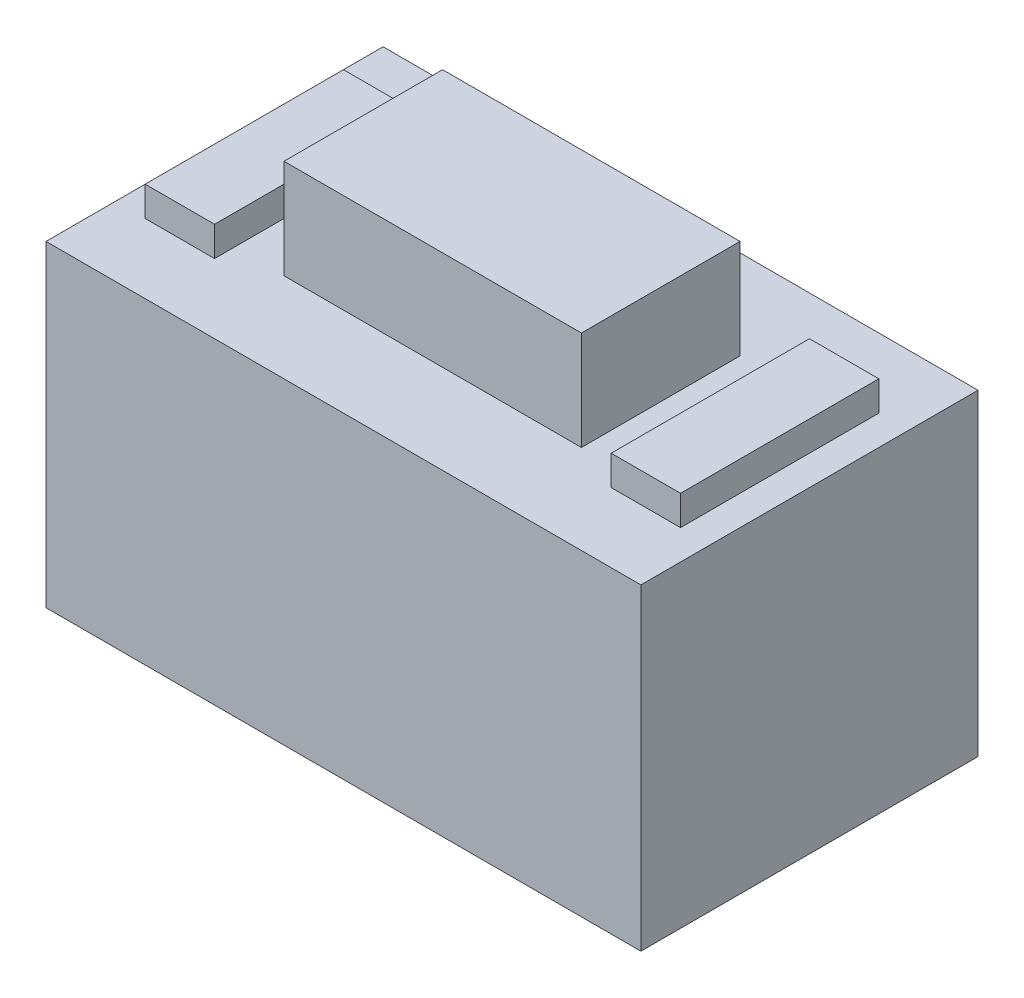
ISO-10303-21;
HEADER;
FILE_DESCRIPTION(('STEP AP214'),'2;1');
FILE_NAME('part.step','',(''),(''),'','','');
FILE_SCHEMA(('AUTOMOTIVE_DESIGN { 1 0 10303 214 1 1 1 1 }'));
ENDSEC;
DATA;
#1=APPLICATION_CONTEXT('core data for automotive mechanical design processes');
#2=APPLICATION_PROTOCOL_DEFINITION('international standard','automotive_design',2000,#1);
#3=PRODUCT_CONTEXT('',#1,'mechanical');
#4=PRODUCT('Part','Part','',(#3));
#5=PRODUCT_RELATED_PRODUCT_CATEGORY('part','',(#4));
#6=PRODUCT_DEFINITION_FORMATION('','',#4);
#7=PRODUCT_DEFINITION_CONTEXT('part definition',#1,'design');
#8=PRODUCT_DEFINITION('design','',#6,#7);
#9=PRODUCT_DEFINITION_SHAPE('','',#8);
#10=(LENGTH_UNIT() NAMED_UNIT(*) SI_UNIT(.MILLI.,.METRE.));
#11=(NAMED_UNIT(*) PLANE_ANGLE_UNIT() SI_UNIT($,.RADIAN.));
#12=(NAMED_UNIT(*) SI_UNIT($,.STERADIAN.) SOLID_ANGLE_UNIT());
#13=UNCERTAINTY_MEASURE_WITH_UNIT(LENGTH_MEASURE(1.E-05),#10,'distance_accuracy_value','');
#14=(GEOMETRIC_REPRESENTATION_CONTEXT(3) GLOBAL_UNCERTAINTY_ASSIGNED_CONTEXT((#13)) GLOBAL_UNIT_ASSIGNED_CONTEXT((#10,
#11,#12)) REPRESENTATION_CONTEXT('',''));
#15=CARTESIAN_POINT('',(0.,0.,0.));
#16=DIRECTION('',(0.,0.,1.));
#17=DIRECTION('',(1.,0.,0.));
#18=AXIS2_PLACEMENT_3D('',#15,#16,#17);
#19=CARTESIAN_POINT('',(-3.,1.6,3.4));
#20=DIRECTION('',(0.,-1.,0.));
#21=DIRECTION('',(0.,0.,-1.));
#22=AXIS2_PLACEMENT_3D('',#19,#20,#21);
#23=PLANE('',#22);
#24=DIRECTION('',(0.,0.,1.));
#25=VECTOR('',#24,1.);
#26=CARTESIAN_POINT('',(-2.7,1.6,0.699999999999999));
#27=LINE('',#26,#25);
#28=CARTESIAN_POINT('',(-2.7,1.6,0.699999999999999));
#29=VERTEX_POINT('',#28);
#30=CARTESIAN_POINT('',(-2.7,1.6,2.7));
#31=VERTEX_POINT('',#30);
#32=EDGE_CURVE('E170',#29,#31,#27,.T.);
#33=ORIENTED_EDGE('',*,*,#32,.F.);
#34=DIRECTION('',(-1.,0.,0.));
#35=VECTOR('',#34,1.);
#36=CARTESIAN_POINT('',(-2.,1.6,0.699999999999999));
#37=LINE('',#36,#35);
#38=CARTESIAN_POINT('',(-2.,1.6,0.699999999999999));
#39=VERTEX_POINT('',#38);
#40=EDGE_CURVE('E183',#39,#29,#37,.T.);
#41=ORIENTED_EDGE('',*,*,#40,.F.);
#42=DIRECTION('',(0.,0.,-1.));
#43=VECTOR('',#42,1.);
#44=CARTESIAN_POINT('',(-2.,1.6,0.699999999999999));
#45=LINE('',#44,#43);
#46=CARTESIAN_POINT('',(-2.,1.6,2.7));
#47=VERTEX_POINT('',#46);
#48=EDGE_CURVE('E192',#47,#39,#45,.T.);
#49=ORIENTED_EDGE('',*,*,#48,.F.);
#50=DIRECTION('',(1.,0.,0.));
#51=VECTOR('',#50,1.);
#52=CARTESIAN_POINT('',(-2.,1.6,2.7));
#53=LINE('',#52,#51);
#54=EDGE_CURVE('E173',#31,#47,#53,.T.);
#55=ORIENTED_EDGE('',*,*,#54,.F.);
#56=EDGE_LOOP('',(#33,#41,#49,#55));
#57=FACE_BOUND('',#56,.T.);
#58=DIRECTION('',(-1.,0.,0.));
#59=VECTOR('',#58,1.);
#60=CARTESIAN_POINT('',(-3.,1.6,0.));
#61=LINE('',#60,#59);
#62=CARTESIAN_POINT('',(3.,1.6,0.));
#63=VERTEX_POINT('',#62);
#64=CARTESIAN_POINT('',(-3.,1.6,0.));
#65=VERTEX_POINT('',#64);
#66=EDGE_CURVE('E255',#63,#65,#61,.T.);
#67=ORIENTED_EDGE('',*,*,#66,.T.);
#68=DIRECTION('',(0.,0.,-1.));
#69=VECTOR('',#68,1.);
#70=CARTESIAN_POINT('',(-3.,1.6,3.4));
#71=LINE('',#70,#69);
#72=CARTESIAN_POINT('',(-3.,1.6,3.4));
#73=VERTEX_POINT('',#72);
#74=EDGE_CURVE('E44',#73,#65,#71,.T.);
#75=ORIENTED_EDGE('',*,*,#74,.F.);
#76=DIRECTION('',(-1.,0.,0.));
#77=VECTOR('',#76,1.);
#78=CARTESIAN_POINT('',(-3.,1.6,3.4));
#79=LINE('',#78,#77);
#80=CARTESIAN_POINT('',(3.,1.6,3.4));
#81=VERTEX_POINT('',#80);
#82=EDGE_CURVE('E245',#81,#73,#79,.T.);
#83=ORIENTED_EDGE('',*,*,#82,.F.);
#84=DIRECTION('',(0.,0.,-1.));
#85=VECTOR('',#84,1.);
#86=CARTESIAN_POINT('',(3.,1.6,3.4));
#87=LINE('',#86,#85);
#88=EDGE_CURVE('E11',#81,#63,#87,.T.);
#89=ORIENTED_EDGE('',*,*,#88,.T.);
#90=EDGE_LOOP('',(#67,#75,#83,#89));
#91=FACE_BOUND('',#90,.T.);
#92=DIRECTION('',(0.,0.,-1.));
#93=VECTOR('',#92,1.);
#94=CARTESIAN_POINT('',(1.5,1.6,2.5));
#95=LINE('',#94,#93);
#96=CARTESIAN_POINT('',(1.5,1.6,2.5));
#97=VERTEX_POINT('',#96);
#98=CARTESIAN_POINT('',(1.5,1.6,0.9));
#99=VERTEX_POINT('',#98);
#100=EDGE_CURVE('E208',#97,#99,#95,.T.);
#101=ORIENTED_EDGE('',*,*,#100,.F.);
#102=DIRECTION('',(1.,0.,0.));
#103=VECTOR('',#102,1.);
#104=CARTESIAN_POINT('',(-1.5,1.6,2.5));
#105=LINE('',#104,#103);
#106=CARTESIAN_POINT('',(-1.5,1.6,2.5));
#107=VERTEX_POINT('',#106);
#108=EDGE_CURVE('E213',#107,#97,#105,.T.);
#109=ORIENTED_EDGE('',*,*,#108,.F.);
#110=DIRECTION('',(0.,0.,1.));
#111=VECTOR('',#110,1.);
#112=CARTESIAN_POINT('',(-1.5,1.6,2.5));
#113=LINE('',#112,#111);
#114=CARTESIAN_POINT('',(-1.5,1.6,0.9));
#115=VERTEX_POINT('',#114);
#116=EDGE_CURVE('E225',#115,#107,#113,.T.);
#117=ORIENTED_EDGE('',*,*,#116,.F.);
#118=DIRECTION('',(-1.,0.,0.));
#119=VECTOR('',#118,1.);
#120=CARTESIAN_POINT('',(-1.5,1.6,0.9));
#121=LINE('',#120,#119);
#122=EDGE_CURVE('E222',#99,#115,#121,.T.);
#123=ORIENTED_EDGE('',*,*,#122,.F.);
#124=EDGE_LOOP('',(#101,#109,#117,#123));
#125=FACE_BOUND('',#124,.T.);
#126=DIRECTION('',(1.,0.,0.));
#127=VECTOR('',#126,1.);
#128=CARTESIAN_POINT('',(2.7,1.6,2.7));
#129=LINE('',#128,#127);
#130=CARTESIAN_POINT('',(2.,1.6,2.7));
#131=VERTEX_POINT('',#130);
#132=CARTESIAN_POINT('',(2.7,1.6,2.7));
#133=VERTEX_POINT('',#132);
#134=EDGE_CURVE('E169',#131,#133,#129,.T.);
#135=ORIENTED_EDGE('',*,*,#134,.F.);
#136=DIRECTION('',(0.,0.,1.));
#137=VECTOR('',#136,1.);
#138=CARTESIAN_POINT('',(2.,1.6,0.699999999999999));
#139=LINE('',#138,#137);
#140=CARTESIAN_POINT('',(2.,1.6,0.699999999999999));
#141=VERTEX_POINT('',#140);
#142=EDGE_CURVE('E166',#141,#131,#139,.T.);
#143=ORIENTED_EDGE('',*,*,#142,.F.);
#144=DIRECTION('',(-1.,0.,0.));
#145=VECTOR('',#144,1.);
#146=CARTESIAN_POINT('',(2.7,1.6,0.699999999999999));
#147=LINE('',#146,#145);
#148=CARTESIAN_POINT('',(2.7,1.6,0.699999999999999));
#149=VERTEX_POINT('',#148);
#150=EDGE_CURVE('E56',#149,#141,#147,.T.);
#151=ORIENTED_EDGE('',*,*,#150,.F.);
#152=DIRECTION('',(0.,0.,-1.));
#153=VECTOR('',#152,1.);
#154=CARTESIAN_POINT('',(2.7,1.6,0.699999999999999));
#155=LINE('',#154,#153);
#156=EDGE_CURVE('E51',#133,#149,#155,.T.);
#157=ORIENTED_EDGE('',*,*,#156,.F.);
#158=EDGE_LOOP('',(#135,#143,#151,#157));
#159=FACE_BOUND('',#158,.T.);
#160=ADVANCED_FACE('F36',(#57,#91,#125,#159),#23,.F.);
#161=CARTESIAN_POINT('',(3.,-1.6,3.4));
#162=DIRECTION('',(-1.,0.,0.));
#163=DIRECTION('',(0.,0.,1.));
#164=AXIS2_PLACEMENT_3D('',#161,#162,#163);
#165=PLANE('',#164);
#166=DIRECTION('',(0.,1.,0.));
#167=VECTOR('',#166,1.);
#168=CARTESIAN_POINT('',(3.,-1.6,0.));
#169=LINE('',#168,#167);
#170=CARTESIAN_POINT('',(3.,-1.6,0.));
#171=VERTEX_POINT('',#170);
#172=EDGE_CURVE('E241',#171,#63,#169,.T.);
#173=ORIENTED_EDGE('',*,*,#172,.T.);
#174=ORIENTED_EDGE('',*,*,#88,.F.);
#175=DIRECTION('',(0.,1.,0.));
#176=VECTOR('',#175,1.);
#177=CARTESIAN_POINT('',(3.,-1.6,3.4));
#178=LINE('',#177,#176);
#179=CARTESIAN_POINT('',(3.,-1.6,3.4));
#180=VERTEX_POINT('',#179);
#181=EDGE_CURVE('E242',#180,#81,#178,.T.);
#182=ORIENTED_EDGE('',*,*,#181,.F.);
#183=DIRECTION('',(0.,0.,-1.));
#184=VECTOR('',#183,1.);
#185=CARTESIAN_POINT('',(3.,-1.6,3.4));
#186=LINE('',#185,#184);
#187=EDGE_CURVE('E252',#180,#171,#186,.T.);
#188=ORIENTED_EDGE('',*,*,#187,.T.);
#189=EDGE_LOOP('',(#173,#174,#182,#188));
#190=FACE_BOUND('',#189,.T.);
#191=ADVANCED_FACE('F38',(#190),#165,.F.);
#192=CARTESIAN_POINT('',(-3.,-1.6,3.4));
#193=DIRECTION('',(1.,0.,0.));
#194=DIRECTION('',(0.,0.,-1.));
#195=AXIS2_PLACEMENT_3D('',#192,#193,#194);
#196=PLANE('',#195);
#197=DIRECTION('',(0.,-1.,0.));
#198=VECTOR('',#197,1.);
#199=CARTESIAN_POINT('',(-3.,-1.6,0.));
#200=LINE('',#199,#198);
#201=CARTESIAN_POINT('',(-3.,-1.6,0.));
#202=VERTEX_POINT('',#201);
#203=EDGE_CURVE('E257',#65,#202,#200,.T.);
#204=ORIENTED_EDGE('',*,*,#203,.T.);
#205=DIRECTION('',(0.,0.,-1.));
#206=VECTOR('',#205,1.);
#207=CARTESIAN_POINT('',(-3.,-1.6,3.4));
#208=LINE('',#207,#206);
#209=CARTESIAN_POINT('',(-3.,-1.6,3.4));
#210=VERTEX_POINT('',#209);
#211=EDGE_CURVE('E262',#210,#202,#208,.T.);
#212=ORIENTED_EDGE('',*,*,#211,.F.);
#213=DIRECTION('',(0.,-1.,0.));
#214=VECTOR('',#213,1.);
#215=CARTESIAN_POINT('',(-3.,-1.6,3.4));
#216=LINE('',#215,#214);
#217=EDGE_CURVE('E248',#73,#210,#216,.T.);
#218=ORIENTED_EDGE('',*,*,#217,.F.);
#219=ORIENTED_EDGE('',*,*,#74,.T.);
#220=EDGE_LOOP('',(#204,#212,#218,#219));
#221=FACE_BOUND('',#220,.T.);
#222=ADVANCED_FACE('F269',(#221),#196,.F.);
#223=CARTESIAN_POINT('',(-3.,-1.6,3.4));
#224=DIRECTION('',(0.,1.,0.));
#225=DIRECTION('',(0.,0.,1.));
#226=AXIS2_PLACEMENT_3D('',#223,#224,#225);
#227=PLANE('',#226);
#228=DIRECTION('',(1.,0.,0.));
#229=VECTOR('',#228,1.);
#230=CARTESIAN_POINT('',(-3.,-1.6,0.));
#231=LINE('',#230,#229);
#232=EDGE_CURVE('E246',#202,#171,#231,.T.);
#233=ORIENTED_EDGE('',*,*,#232,.T.);
#234=ORIENTED_EDGE('',*,*,#187,.F.);
#235=DIRECTION('',(1.,0.,0.));
#236=VECTOR('',#235,1.);
#237=CARTESIAN_POINT('',(-3.,-1.6,3.4));
#238=LINE('',#237,#236);
#239=EDGE_CURVE('E250',#210,#180,#238,.T.);
#240=ORIENTED_EDGE('',*,*,#239,.F.);
#241=ORIENTED_EDGE('',*,*,#211,.T.);
#242=EDGE_LOOP('',(#233,#234,#240,#241));
#243=FACE_BOUND('',#242,.T.);
#244=ADVANCED_FACE('F278',(#243),#227,.F.);
#245=CARTESIAN_POINT('',(0.,0.,3.4));
#246=DIRECTION('',(0.,0.,-1.));
#247=DIRECTION('',(-1.,0.,0.));
#248=AXIS2_PLACEMENT_3D('',#245,#246,#247);
#249=PLANE('',#248);
#250=ORIENTED_EDGE('',*,*,#181,.T.);
#251=ORIENTED_EDGE('',*,*,#82,.T.);
#252=ORIENTED_EDGE('',*,*,#217,.T.);
#253=ORIENTED_EDGE('',*,*,#239,.T.);
#254=EDGE_LOOP('',(#250,#251,#252,#253));
#255=FACE_BOUND('',#254,.T.);
#256=ADVANCED_FACE('F284',(#255),#249,.F.);
#257=CARTESIAN_POINT('',(0.,0.,0.));
#258=DIRECTION('',(0.,0.,-1.));
#259=DIRECTION('',(-1.,0.,0.));
#260=AXIS2_PLACEMENT_3D('',#257,#258,#259);
#261=PLANE('',#260);
#262=ORIENTED_EDGE('',*,*,#172,.F.);
#263=ORIENTED_EDGE('',*,*,#232,.F.);
#264=ORIENTED_EDGE('',*,*,#203,.F.);
#265=ORIENTED_EDGE('',*,*,#66,.F.);
#266=EDGE_LOOP('',(#262,#263,#264,#265));
#267=FACE_BOUND('',#266,.T.);
#268=ADVANCED_FACE('F275',(#267),#261,.T.);
#269=CARTESIAN_POINT('',(1.5,2.6,2.5));
#270=DIRECTION('',(-1.,0.,0.));
#271=DIRECTION('',(0.,0.,1.));
#272=AXIS2_PLACEMENT_3D('',#269,#270,#271);
#273=PLANE('',#272);
#274=ORIENTED_EDGE('',*,*,#100,.T.);
#275=DIRECTION('',(0.,-1.,0.));
#276=VECTOR('',#275,1.);
#277=CARTESIAN_POINT('',(1.5,2.6,0.9));
#278=LINE('',#277,#276);
#279=CARTESIAN_POINT('',(1.5,2.6,0.9));
#280=VERTEX_POINT('',#279);
#281=EDGE_CURVE('E238',#280,#99,#278,.T.);
#282=ORIENTED_EDGE('',*,*,#281,.F.);
#283=DIRECTION('',(0.,0.,-1.));
#284=VECTOR('',#283,1.);
#285=CARTESIAN_POINT('',(1.5,2.6,2.5));
#286=LINE('',#285,#284);
#287=CARTESIAN_POINT('',(1.5,2.6,2.5));
#288=VERTEX_POINT('',#287);
#289=EDGE_CURVE('E209',#288,#280,#286,.T.);
#290=ORIENTED_EDGE('',*,*,#289,.F.);
#291=DIRECTION('',(0.,-1.,0.));
#292=VECTOR('',#291,1.);
#293=CARTESIAN_POINT('',(1.5,2.6,2.5));
#294=LINE('',#293,#292);
#295=EDGE_CURVE('E219',#288,#97,#294,.T.);
#296=ORIENTED_EDGE('',*,*,#295,.T.);
#297=EDGE_LOOP('',(#274,#282,#290,#296));
#298=FACE_BOUND('',#297,.T.);
#299=ADVANCED_FACE('F350',(#298),#273,.F.);
#300=CARTESIAN_POINT('',(-1.5,2.6,0.9));
#301=DIRECTION('',(0.,0.,1.));
#302=DIRECTION('',(1.,0.,0.));
#303=AXIS2_PLACEMENT_3D('',#300,#301,#302);
#304=PLANE('',#303);
#305=ORIENTED_EDGE('',*,*,#122,.T.);
#306=DIRECTION('',(0.,-1.,0.));
#307=VECTOR('',#306,1.);
#308=CARTESIAN_POINT('',(-1.5,2.6,0.9));
#309=LINE('',#308,#307);
#310=CARTESIAN_POINT('',(-1.5,2.6,0.9));
#311=VERTEX_POINT('',#310);
#312=EDGE_CURVE('E235',#311,#115,#309,.T.);
#313=ORIENTED_EDGE('',*,*,#312,.F.);
#314=DIRECTION('',(-1.,0.,0.));
#315=VECTOR('',#314,1.);
#316=CARTESIAN_POINT('',(-1.5,2.6,0.9));
#317=LINE('',#316,#315);
#318=EDGE_CURVE('E212',#280,#311,#317,.T.);
#319=ORIENTED_EDGE('',*,*,#318,.F.);
#320=ORIENTED_EDGE('',*,*,#281,.T.);
#321=EDGE_LOOP('',(#305,#313,#319,#320));
#322=FACE_BOUND('',#321,.T.);
#323=ADVANCED_FACE('F346',(#322),#304,.F.);
#324=CARTESIAN_POINT('',(-1.5,2.6,2.5));
#325=DIRECTION('',(1.,0.,0.));
#326=DIRECTION('',(0.,0.,-1.));
#327=AXIS2_PLACEMENT_3D('',#324,#325,#326);
#328=PLANE('',#327);
#329=ORIENTED_EDGE('',*,*,#116,.T.);
#330=DIRECTION('',(0.,-1.,0.));
#331=VECTOR('',#330,1.);
#332=CARTESIAN_POINT('',(-1.5,2.6,2.5));
#333=LINE('',#332,#331);
#334=CARTESIAN_POINT('',(-1.5,2.6,2.5));
#335=VERTEX_POINT('',#334);
#336=EDGE_CURVE('E232',#335,#107,#333,.T.);
#337=ORIENTED_EDGE('',*,*,#336,.F.);
#338=DIRECTION('',(0.,0.,1.));
#339=VECTOR('',#338,1.);
#340=CARTESIAN_POINT('',(-1.5,2.6,2.5));
#341=LINE('',#340,#339);
#342=EDGE_CURVE('E215',#311,#335,#341,.T.);
#343=ORIENTED_EDGE('',*,*,#342,.F.);
#344=ORIENTED_EDGE('',*,*,#312,.T.);
#345=EDGE_LOOP('',(#329,#337,#343,#344));
#346=FACE_BOUND('',#345,.T.);
#347=ADVANCED_FACE('F342',(#346),#328,.F.);
#348=CARTESIAN_POINT('',(-1.5,2.6,2.5));
#349=DIRECTION('',(0.,0.,-1.));
#350=DIRECTION('',(-1.,0.,0.));
#351=AXIS2_PLACEMENT_3D('',#348,#349,#350);
#352=PLANE('',#351);
#353=ORIENTED_EDGE('',*,*,#108,.T.);
#354=ORIENTED_EDGE('',*,*,#295,.F.);
#355=DIRECTION('',(1.,0.,0.));
#356=VECTOR('',#355,1.);
#357=CARTESIAN_POINT('',(-1.5,2.6,2.5));
#358=LINE('',#357,#356);
#359=EDGE_CURVE('E217',#335,#288,#358,.T.);
#360=ORIENTED_EDGE('',*,*,#359,.F.);
#361=ORIENTED_EDGE('',*,*,#336,.T.);
#362=EDGE_LOOP('',(#353,#354,#360,#361));
#363=FACE_BOUND('',#362,.T.);
#364=ADVANCED_FACE('F338',(#363),#352,.F.);
#365=CARTESIAN_POINT('',(0.,2.6,0.));
#366=DIRECTION('',(0.,-1.,0.));
#367=DIRECTION('',(0.,0.,-1.));
#368=AXIS2_PLACEMENT_3D('',#365,#366,#367);
#369=PLANE('',#368);
#370=ORIENTED_EDGE('',*,*,#289,.T.);
#371=ORIENTED_EDGE('',*,*,#318,.T.);
#372=ORIENTED_EDGE('',*,*,#342,.T.);
#373=ORIENTED_EDGE('',*,*,#359,.T.);
#374=EDGE_LOOP('',(#370,#371,#372,#373));
#375=FACE_BOUND('',#374,.T.);
#376=ADVANCED_FACE('F334',(#375),#369,.F.);
#377=CARTESIAN_POINT('',(-2.7,1.9,0.699999999999999));
#378=DIRECTION('',(1.,0.,0.));
#379=DIRECTION('',(0.,0.,-1.));
#380=AXIS2_PLACEMENT_3D('',#377,#378,#379);
#381=PLANE('',#380);
#382=ORIENTED_EDGE('',*,*,#32,.T.);
#383=DIRECTION('',(0.,-1.,0.));
#384=VECTOR('',#383,1.);
#385=CARTESIAN_POINT('',(-2.7,1.9,2.7));
#386=LINE('',#385,#384);
#387=CARTESIAN_POINT('',(-2.7,1.9,2.7));
#388=VERTEX_POINT('',#387);
#389=EDGE_CURVE('E205',#388,#31,#386,.T.);
#390=ORIENTED_EDGE('',*,*,#389,.F.);
#391=DIRECTION('',(0.,0.,1.));
#392=VECTOR('',#391,1.);
#393=CARTESIAN_POINT('',(-2.7,1.9,0.699999999999999));
#394=LINE('',#393,#392);
#395=CARTESIAN_POINT('',(-2.7,1.9,0.699999999999999));
#396=VERTEX_POINT('',#395);
#397=EDGE_CURVE('E179',#396,#388,#394,.T.);
#398=ORIENTED_EDGE('',*,*,#397,.F.);
#399=DIRECTION('',(0.,-1.,0.));
#400=VECTOR('',#399,1.);
#401=CARTESIAN_POINT('',(-2.7,1.9,0.699999999999999));
#402=LINE('',#401,#400);
#403=EDGE_CURVE('E188',#396,#29,#402,.T.);
#404=ORIENTED_EDGE('',*,*,#403,.T.);
#405=EDGE_LOOP('',(#382,#390,#398,#404));
#406=FACE_BOUND('',#405,.T.);
#407=ADVANCED_FACE('F330',(#406),#381,.F.);
#408=CARTESIAN_POINT('',(-2.,1.9,2.7));
#409=DIRECTION('',(0.,0.,-1.));
#410=DIRECTION('',(-1.,0.,0.));
#411=AXIS2_PLACEMENT_3D('',#408,#409,#410);
#412=PLANE('',#411);
#413=ORIENTED_EDGE('',*,*,#54,.T.);
#414=DIRECTION('',(0.,-1.,0.));
#415=VECTOR('',#414,1.);
#416=CARTESIAN_POINT('',(-2.,1.9,2.7));
#417=LINE('',#416,#415);
#418=CARTESIAN_POINT('',(-2.,1.9,2.7));
#419=VERTEX_POINT('',#418);
#420=EDGE_CURVE('E202',#419,#47,#417,.T.);
#421=ORIENTED_EDGE('',*,*,#420,.F.);
#422=DIRECTION('',(1.,0.,0.));
#423=VECTOR('',#422,1.);
#424=CARTESIAN_POINT('',(-2.,1.9,2.7));
#425=LINE('',#424,#423);
#426=EDGE_CURVE('E182',#388,#419,#425,.T.);
#427=ORIENTED_EDGE('',*,*,#426,.F.);
#428=ORIENTED_EDGE('',*,*,#389,.T.);
#429=EDGE_LOOP('',(#413,#421,#427,#428));
#430=FACE_BOUND('',#429,.T.);
#431=ADVANCED_FACE('F326',(#430),#412,.F.);
#432=CARTESIAN_POINT('',(-2.,1.9,0.699999999999999));
#433=DIRECTION('',(-1.,0.,0.));
#434=DIRECTION('',(0.,0.,1.));
#435=AXIS2_PLACEMENT_3D('',#432,#433,#434);
#436=PLANE('',#435);
#437=ORIENTED_EDGE('',*,*,#48,.T.);
#438=DIRECTION('',(0.,-1.,0.));
#439=VECTOR('',#438,1.);
#440=CARTESIAN_POINT('',(-2.,1.9,0.699999999999999));
#441=LINE('',#440,#439);
#442=CARTESIAN_POINT('',(-2.,1.9,0.699999999999999));
#443=VERTEX_POINT('',#442);
#444=EDGE_CURVE('E199',#443,#39,#441,.T.);
#445=ORIENTED_EDGE('',*,*,#444,.F.);
#446=DIRECTION('',(0.,0.,-1.));
#447=VECTOR('',#446,1.);
#448=CARTESIAN_POINT('',(-2.,1.9,0.699999999999999));
#449=LINE('',#448,#447);
#450=EDGE_CURVE('E185',#419,#443,#449,.T.);
#451=ORIENTED_EDGE('',*,*,#450,.F.);
#452=ORIENTED_EDGE('',*,*,#420,.T.);
#453=EDGE_LOOP('',(#437,#445,#451,#452));
#454=FACE_BOUND('',#453,.T.);
#455=ADVANCED_FACE('F322',(#454),#436,.F.);
#456=CARTESIAN_POINT('',(-2.,1.9,0.699999999999999));
#457=DIRECTION('',(0.,0.,1.));
#458=DIRECTION('',(1.,0.,0.));
#459=AXIS2_PLACEMENT_3D('',#456,#457,#458);
#460=PLANE('',#459);
#461=ORIENTED_EDGE('',*,*,#40,.T.);
#462=ORIENTED_EDGE('',*,*,#403,.F.);
#463=DIRECTION('',(-1.,0.,0.));
#464=VECTOR('',#463,1.);
#465=CARTESIAN_POINT('',(-2.,1.9,0.699999999999999));
#466=LINE('',#465,#464);
#467=EDGE_CURVE('E187',#443,#396,#466,.T.);
#468=ORIENTED_EDGE('',*,*,#467,.F.);
#469=ORIENTED_EDGE('',*,*,#444,.T.);
#470=EDGE_LOOP('',(#461,#462,#468,#469));
#471=FACE_BOUND('',#470,.T.);
#472=ADVANCED_FACE('F318',(#471),#460,.F.);
#473=CARTESIAN_POINT('',(0.,1.9,0.));
#474=DIRECTION('',(0.,-1.,0.));
#475=DIRECTION('',(0.,0.,-1.));
#476=AXIS2_PLACEMENT_3D('',#473,#474,#475);
#477=PLANE('',#476);
#478=ORIENTED_EDGE('',*,*,#397,.T.);
#479=ORIENTED_EDGE('',*,*,#426,.T.);
#480=ORIENTED_EDGE('',*,*,#450,.T.);
#481=ORIENTED_EDGE('',*,*,#467,.T.);
#482=EDGE_LOOP('',(#478,#479,#480,#481));
#483=FACE_BOUND('',#482,.T.);
#484=ADVANCED_FACE('F315',(#483),#477,.F.);
#485=CARTESIAN_POINT('',(2.7,1.9,2.7));
#486=DIRECTION('',(0.,0.,-1.));
#487=DIRECTION('',(-1.,0.,0.));
#488=AXIS2_PLACEMENT_3D('',#485,#486,#487);
#489=PLANE('',#488);
#490=ORIENTED_EDGE('',*,*,#134,.T.);
#491=DIRECTION('',(0.,-1.,0.));
#492=VECTOR('',#491,1.);
#493=CARTESIAN_POINT('',(2.7,1.9,2.7));
#494=LINE('',#493,#492);
#495=CARTESIAN_POINT('',(2.7,1.9,2.7));
#496=VERTEX_POINT('',#495);
#497=EDGE_CURVE('E150',#496,#133,#494,.T.);
#498=ORIENTED_EDGE('',*,*,#497,.F.);
#499=DIRECTION('',(1.,0.,0.));
#500=VECTOR('',#499,1.);
#501=CARTESIAN_POINT('',(2.7,1.9,2.7));
#502=LINE('',#501,#500);
#503=CARTESIAN_POINT('',(2.,1.9,2.7));
#504=VERTEX_POINT('',#503);
#505=EDGE_CURVE('E157',#504,#496,#502,.T.);
#506=ORIENTED_EDGE('',*,*,#505,.F.);
#507=DIRECTION('',(0.,-1.,0.));
#508=VECTOR('',#507,1.);
#509=CARTESIAN_POINT('',(2.,1.9,2.7));
#510=LINE('',#509,#508);
#511=EDGE_CURVE('E293',#504,#131,#510,.T.);
#512=ORIENTED_EDGE('',*,*,#511,.T.);
#513=EDGE_LOOP('',(#490,#498,#506,#512));
#514=FACE_BOUND('',#513,.T.);
#515=ADVANCED_FACE('F168',(#514),#489,.F.);
#516=CARTESIAN_POINT('',(2.7,1.9,0.699999999999999));
#517=DIRECTION('',(-1.,0.,0.));
#518=DIRECTION('',(0.,0.,1.));
#519=AXIS2_PLACEMENT_3D('',#516,#517,#518);
#520=PLANE('',#519);
#521=ORIENTED_EDGE('',*,*,#156,.T.);
#522=DIRECTION('',(0.,-1.,0.));
#523=VECTOR('',#522,1.);
#524=CARTESIAN_POINT('',(2.7,1.9,0.699999999999999));
#525=LINE('',#524,#523);
#526=CARTESIAN_POINT('',(2.7,1.9,0.699999999999999));
#527=VERTEX_POINT('',#526);
#528=EDGE_CURVE('E153',#527,#149,#525,.T.);
#529=ORIENTED_EDGE('',*,*,#528,.F.);
#530=DIRECTION('',(0.,0.,-1.));
#531=VECTOR('',#530,1.);
#532=CARTESIAN_POINT('',(2.7,1.9,0.699999999999999));
#533=LINE('',#532,#531);
#534=EDGE_CURVE('E146',#496,#527,#533,.T.);
#535=ORIENTED_EDGE('',*,*,#534,.F.);
#536=ORIENTED_EDGE('',*,*,#497,.T.);
#537=EDGE_LOOP('',(#521,#529,#535,#536));
#538=FACE_BOUND('',#537,.T.);
#539=ADVANCED_FACE('F148',(#538),#520,.F.);
#540=CARTESIAN_POINT('',(2.7,1.9,0.699999999999999));
#541=DIRECTION('',(0.,0.,1.));
#542=DIRECTION('',(1.,0.,0.));
#543=AXIS2_PLACEMENT_3D('',#540,#541,#542);
#544=PLANE('',#543);
#545=ORIENTED_EDGE('',*,*,#150,.T.);
#546=DIRECTION('',(0.,-1.,0.));
#547=VECTOR('',#546,1.);
#548=CARTESIAN_POINT('',(2.,1.9,0.699999999999999));
#549=LINE('',#548,#547);
#550=CARTESIAN_POINT('',(2.,1.9,0.699999999999999));
#551=VERTEX_POINT('',#550);
#552=EDGE_CURVE('E175',#551,#141,#549,.T.);
#553=ORIENTED_EDGE('',*,*,#552,.F.);
#554=DIRECTION('',(-1.,0.,0.));
#555=VECTOR('',#554,1.);
#556=CARTESIAN_POINT('',(2.7,1.9,0.699999999999999));
#557=LINE('',#556,#555);
#558=EDGE_CURVE('E156',#527,#551,#557,.T.);
#559=ORIENTED_EDGE('',*,*,#558,.F.);
#560=ORIENTED_EDGE('',*,*,#528,.T.);
#561=EDGE_LOOP('',(#545,#553,#559,#560));
#562=FACE_BOUND('',#561,.T.);
#563=ADVANCED_FACE('F302',(#562),#544,.F.);
#564=CARTESIAN_POINT('',(2.,1.9,0.699999999999999));
#565=DIRECTION('',(1.,0.,0.));
#566=DIRECTION('',(0.,0.,-1.));
#567=AXIS2_PLACEMENT_3D('',#564,#565,#566);
#568=PLANE('',#567);
#569=ORIENTED_EDGE('',*,*,#142,.T.);
#570=ORIENTED_EDGE('',*,*,#511,.F.);
#571=DIRECTION('',(0.,0.,1.));
#572=VECTOR('',#571,1.);
#573=CARTESIAN_POINT('',(2.,1.9,0.699999999999999));
#574=LINE('',#573,#572);
#575=EDGE_CURVE('E162',#551,#504,#574,.T.);
#576=ORIENTED_EDGE('',*,*,#575,.F.);
#577=ORIENTED_EDGE('',*,*,#552,.T.);
#578=EDGE_LOOP('',(#569,#570,#576,#577));
#579=FACE_BOUND('',#578,.T.);
#580=ADVANCED_FACE('F292',(#579),#568,.F.);
#581=CARTESIAN_POINT('',(0.,1.9,0.));
#582=DIRECTION('',(0.,1.,0.));
#583=DIRECTION('',(0.,0.,1.));
#584=AXIS2_PLACEMENT_3D('',#581,#582,#583);
#585=PLANE('',#584);
#586=ORIENTED_EDGE('',*,*,#505,.T.);
#587=ORIENTED_EDGE('',*,*,#534,.T.);
#588=ORIENTED_EDGE('',*,*,#558,.T.);
#589=ORIENTED_EDGE('',*,*,#575,.T.);
#590=EDGE_LOOP('',(#586,#587,#588,#589));
#591=FACE_BOUND('',#590,.T.);
#592=ADVANCED_FACE('F160',(#591),#585,.T.);
#593=CLOSED_SHELL('',(#160,#191,#222,#244,#256,#268,#299,#323,#347,#364,#376,#407,#431,#455,
#472,#484,#515,#539,#563,#580,#592));
#594=MANIFOLD_SOLID_BREP('B2',#593);
#595=ADVANCED_BREP_SHAPE_REPRESENTATION('',(#18,#594),#14);
#596=SHAPE_DEFINITION_REPRESENTATION(#9,#595);
ENDSEC;
END-ISO-10303-21;
